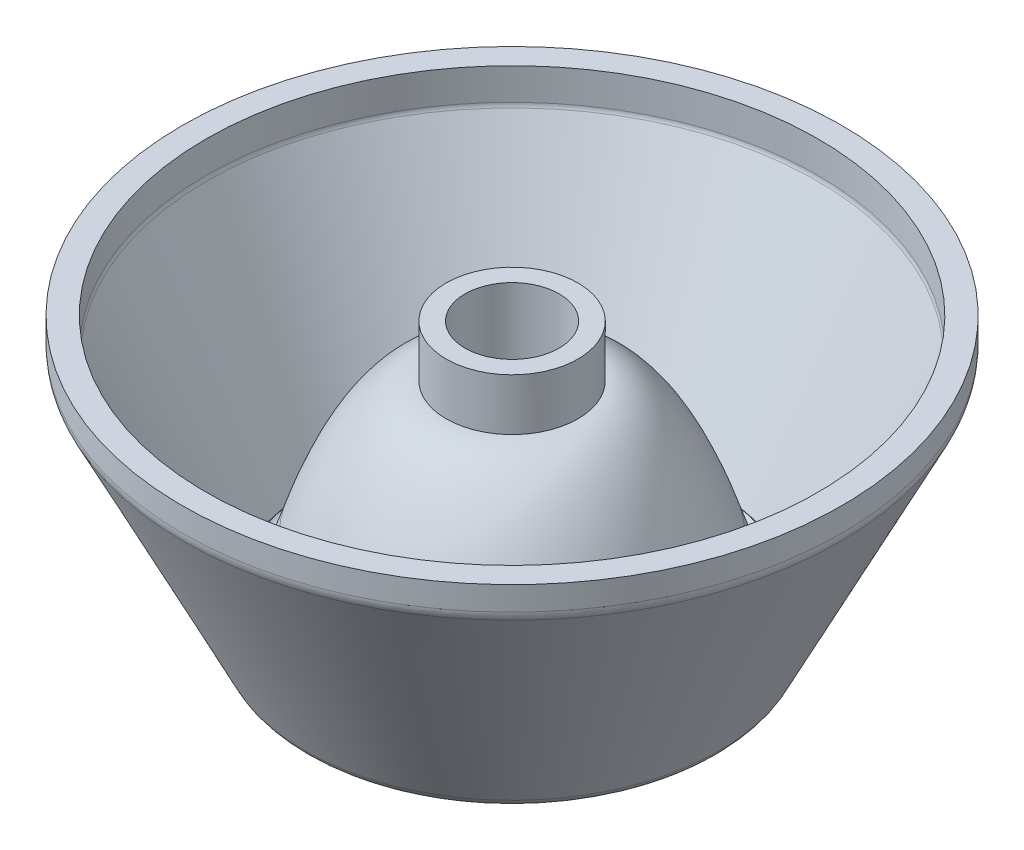
ISO-10303-21;
HEADER;
FILE_DESCRIPTION(('STEP AP214'),'2;1');
FILE_NAME('part.step','',(''),(''),'','','');
FILE_SCHEMA(('AUTOMOTIVE_DESIGN { 1 0 10303 214 1 1 1 1 }'));
ENDSEC;
DATA;
#1=APPLICATION_CONTEXT('core data for automotive mechanical design processes');
#2=APPLICATION_PROTOCOL_DEFINITION('international standard','automotive_design',2000,#1);
#3=PRODUCT_CONTEXT('',#1,'mechanical');
#4=PRODUCT('Part','Part','',(#3));
#5=PRODUCT_RELATED_PRODUCT_CATEGORY('part','',(#4));
#6=PRODUCT_DEFINITION_FORMATION('','',#4);
#7=PRODUCT_DEFINITION_CONTEXT('part definition',#1,'design');
#8=PRODUCT_DEFINITION('design','',#6,#7);
#9=PRODUCT_DEFINITION_SHAPE('','',#8);
#10=(LENGTH_UNIT() NAMED_UNIT(*) SI_UNIT(.MILLI.,.METRE.));
#11=(NAMED_UNIT(*) PLANE_ANGLE_UNIT() SI_UNIT($,.RADIAN.));
#12=(NAMED_UNIT(*) SI_UNIT($,.STERADIAN.) SOLID_ANGLE_UNIT());
#13=UNCERTAINTY_MEASURE_WITH_UNIT(LENGTH_MEASURE(1.E-05),#10,'distance_accuracy_value','');
#14=(GEOMETRIC_REPRESENTATION_CONTEXT(3) GLOBAL_UNCERTAINTY_ASSIGNED_CONTEXT((#13)) GLOBAL_UNIT_ASSIGNED_CONTEXT((#10,
#11,#12)) REPRESENTATION_CONTEXT('',''));
#15=CARTESIAN_POINT('',(0.,0.,0.));
#16=DIRECTION('',(0.,0.,1.));
#17=DIRECTION('',(1.,0.,0.));
#18=AXIS2_PLACEMENT_3D('',#15,#16,#17);
#19=CARTESIAN_POINT('',(6.41575187069401E-13,25.3119668593289,5.32451627771019E-05));
#20=DIRECTION('',(0.,-1.,0.));
#21=DIRECTION('',(0.,0.,-1.));
#22=AXIS2_PLACEMENT_3D('',#19,#20,#21);
#23=TOROIDAL_SURFACE('',#22,47.2499989103526,1.5);
#24=CARTESIAN_POINT('',(6.41947567188462E-13,24.6411464809619,5.32451627771019E-05));
#25=DIRECTION('',(0.,-1.,0.));
#26=DIRECTION('',(1.,0.,0.));
#27=AXIS2_PLACEMENT_3D('',#24,#25,#26);
#28=CIRCLE('',#27,48.5916397042939);
#29=CARTESIAN_POINT('',(-48.5916397042933,24.6411464809619,5.32451627711512E-05));
#30=VERTEX_POINT('',#29);
#31=CARTESIAN_POINT('',(6.35996807585543E-13,24.6411464809619,48.5916929494567));
#32=VERTEX_POINT('',#31);
#33=EDGE_CURVE('E11',#30,#32,#28,.T.);
#34=ORIENTED_EDGE('',*,*,#33,.T.);
#35=CARTESIAN_POINT('',(6.35788731076873E-13,25.3119668593289,47.2500521555154));
#36=DIRECTION('',(-1.,0.,0.));
#37=DIRECTION('',(0.,0.,1.));
#38=AXIS2_PLACEMENT_3D('',#35,#36,#37);
#39=CIRCLE('',#38,1.5);
#40=CARTESIAN_POINT('',(6.35605034057001E-13,25.3119668593289,48.7500521555154));
#41=VERTEX_POINT('',#40);
#42=EDGE_CURVE('E57',#32,#41,#39,.T.);
#43=ORIENTED_EDGE('',*,*,#42,.T.);
#44=CARTESIAN_POINT('',(6.41575187069401E-13,25.3119668593289,5.32451627771019E-05));
#45=DIRECTION('',(0.,-1.,0.));
#46=DIRECTION('',(1.,0.,0.));
#47=AXIS2_PLACEMENT_3D('',#44,#45,#46);
#48=CIRCLE('',#47,48.7499989103526);
#49=CARTESIAN_POINT('',(-48.7499989103519,25.3119668593289,5.32451627711318E-05));
#50=VERTEX_POINT('',#49);
#51=EDGE_CURVE('E158',#50,#41,#48,.T.);
#52=ORIENTED_EDGE('',*,*,#51,.F.);
#53=CARTESIAN_POINT('',(6.41575187069401E-13,25.3119668593289,5.32451627771019E-05));
#54=DIRECTION('',(0.,-1.,0.));
#55=DIRECTION('',(1.,0.,0.));
#56=AXIS2_PLACEMENT_3D('',#53,#54,#55);
#57=CIRCLE('',#56,48.7499989103526);
#58=EDGE_CURVE('E130',#41,#50,#57,.T.);
#59=ORIENTED_EDGE('',*,*,#58,.F.);
#60=ORIENTED_EDGE('',*,*,#42,.F.);
#61=CARTESIAN_POINT('',(6.41947567188462E-13,24.6411464809619,5.32451627771019E-05));
#62=DIRECTION('',(0.,-1.,0.));
#63=DIRECTION('',(1.,0.,0.));
#64=AXIS2_PLACEMENT_3D('',#61,#62,#63);
#65=CIRCLE('',#64,48.5916397042939);
#66=EDGE_CURVE('E234',#32,#30,#65,.T.);
#67=ORIENTED_EDGE('',*,*,#66,.T.);
#68=EDGE_LOOP('',(#34,#43,#52,#59,#60,#67));
#69=FACE_BOUND('',#68,.T.);
#70=ADVANCED_FACE('F46',(#69),#23,.F.);
#71=CARTESIAN_POINT('',(6.40174668630977E-13,27.8349165569222,5.32451627771019E-05));
#72=DIRECTION('',(0.,-1.,0.));
#73=DIRECTION('',(1.,0.,0.));
#74=AXIS2_PLACEMENT_3D('',#71,#72,#73);
#75=CYLINDRICAL_SURFACE('',#74,48.7499989103526);
#76=ORIENTED_EDGE('',*,*,#51,.T.);
#77=ORIENTED_EDGE('',*,*,#58,.T.);
#78=DIRECTION('',(0.,1.,0.));
#79=VECTOR('',#78,1.);
#80=CARTESIAN_POINT('',(-48.7499989103519,27.8349165569222,5.32451627711318E-05));
#81=LINE('',#80,#79);
#82=CARTESIAN_POINT('',(-48.7499989103519,30.3578662545155,5.32451627711318E-05));
#83=VERTEX_POINT('',#82);
#84=EDGE_CURVE('E120',#50,#83,#81,.T.);
#85=ORIENTED_EDGE('',*,*,#84,.T.);
#86=CARTESIAN_POINT('',(6.38774150192554E-13,30.3578662545155,5.32451627771019E-05));
#87=DIRECTION('',(0.,-1.,0.));
#88=DIRECTION('',(1.,0.,0.));
#89=AXIS2_PLACEMENT_3D('',#86,#87,#88);
#90=CIRCLE('',#89,48.7499989103526);
#91=EDGE_CURVE('E118',#83,#83,#90,.T.);
#92=ORIENTED_EDGE('',*,*,#91,.F.);
#93=ORIENTED_EDGE('',*,*,#84,.F.);
#94=EDGE_LOOP('',(#76,#77,#85,#92,#93));
#95=FACE_BOUND('',#94,.T.);
#96=ADVANCED_FACE('F119',(#95),#75,.F.);
#97=CARTESIAN_POINT('',(52.4999989103532,30.3578662545155,5.32451627771019E-05));
#98=DIRECTION('',(0.,1.,0.));
#99=DIRECTION('',(1.,0.,0.));
#100=AXIS2_PLACEMENT_3D('',#97,#98,#99);
#101=PLANE('',#100);
#102=CARTESIAN_POINT('',(6.38774150192554E-13,30.3578662545155,5.32451627771019E-05));
#103=DIRECTION('',(0.,-1.,0.));
#104=DIRECTION('',(1.,0.,0.));
#105=AXIS2_PLACEMENT_3D('',#102,#103,#104);
#106=CIRCLE('',#105,52.4999989103526);
#107=CARTESIAN_POINT('',(-52.499998910352,30.3578662545155,5.32451627706725E-05));
#108=VERTEX_POINT('',#107);
#109=EDGE_CURVE('E133',#108,#108,#106,.T.);
#110=ORIENTED_EDGE('',*,*,#109,.F.);
#111=EDGE_LOOP('',(#110));
#112=FACE_BOUND('',#111,.T.);
#113=ORIENTED_EDGE('',*,*,#91,.T.);
#114=EDGE_LOOP('',(#113));
#115=FACE_BOUND('',#114,.T.);
#116=ADVANCED_FACE('F470',(#112,#115),#101,.T.);
#117=CARTESIAN_POINT('',(6.39826585389041E-13,28.4619675730944,5.32451627771019E-05));
#118=DIRECTION('',(0.,-1.,0.));
#119=DIRECTION('',(1.,0.,0.));
#120=AXIS2_PLACEMENT_3D('',#117,#118,#119);
#121=CYLINDRICAL_SURFACE('',#120,52.4999989103526);
#122=CARTESIAN_POINT('',(6.40879020585528E-13,26.5660688916734,5.32451627771019E-05));
#123=DIRECTION('',(0.,-1.,0.));
#124=DIRECTION('',(1.,0.,0.));
#125=AXIS2_PLACEMENT_3D('',#122,#123,#124);
#126=CIRCLE('',#125,52.4999989103526);
#127=CARTESIAN_POINT('',(-52.499998910352,26.5660688916734,5.32451627706725E-05));
#128=VERTEX_POINT('',#127);
#129=CARTESIAN_POINT('',(6.34449625023447E-13,26.5660688916734,52.5000521555154));
#130=VERTEX_POINT('',#129);
#131=EDGE_CURVE('E159',#128,#130,#126,.T.);
#132=ORIENTED_EDGE('',*,*,#131,.F.);
#133=DIRECTION('',(0.,1.,0.));
#134=VECTOR('',#133,1.);
#135=CARTESIAN_POINT('',(-52.499998910352,28.4619675730944,5.32451627706725E-05));
#136=LINE('',#135,#134);
#137=EDGE_CURVE('E124',#128,#108,#136,.T.);
#138=ORIENTED_EDGE('',*,*,#137,.T.);
#139=ORIENTED_EDGE('',*,*,#109,.T.);
#140=ORIENTED_EDGE('',*,*,#137,.F.);
#141=CARTESIAN_POINT('',(6.40879020585528E-13,26.5660688916734,5.32451627771019E-05));
#142=DIRECTION('',(0.,-1.,0.));
#143=DIRECTION('',(1.,0.,0.));
#144=AXIS2_PLACEMENT_3D('',#141,#142,#143);
#145=CIRCLE('',#144,52.4999989103526);
#146=EDGE_CURVE('E162',#130,#128,#145,.T.);
#147=ORIENTED_EDGE('',*,*,#146,.F.);
#148=EDGE_LOOP('',(#132,#138,#139,#140,#147));
#149=FACE_BOUND('',#148,.T.);
#150=ADVANCED_FACE('F385',(#149),#121,.T.);
#151=CARTESIAN_POINT('',(6.40879020585528E-13,26.5660688916734,5.32451627771019E-05));
#152=DIRECTION('',(0.,-1.,0.));
#153=DIRECTION('',(0.,0.,-1.));
#154=AXIS2_PLACEMENT_3D('',#151,#152,#153);
#155=TOROIDAL_SURFACE('',#154,49.4999989103526,3.);
#156=CARTESIAN_POINT('',(6.41623780823649E-13,25.2244281349394,5.32451627771019E-05));
#157=DIRECTION('',(0.,-1.,0.));
#158=DIRECTION('',(1.,0.,0.));
#159=AXIS2_PLACEMENT_3D('',#156,#157,#158);
#160=CIRCLE('',#159,52.1832804982353);
#161=CARTESIAN_POINT('',(-52.1832804982347,25.2244281349394,5.32451627707113E-05));
#162=VERTEX_POINT('',#161);
#163=CARTESIAN_POINT('',(6.35233172080531E-13,25.2244281349394,52.1833337433981));
#164=VERTEX_POINT('',#163);
#165=EDGE_CURVE('E260',#162,#164,#160,.T.);
#166=ORIENTED_EDGE('',*,*,#165,.F.);
#167=CARTESIAN_POINT('',(6.41623780823649E-13,25.2244281349394,5.32451627771019E-05));
#168=DIRECTION('',(0.,-1.,0.));
#169=DIRECTION('',(1.,0.,0.));
#170=AXIS2_PLACEMENT_3D('',#167,#168,#169);
#171=CIRCLE('',#170,52.1832804982353);
#172=EDGE_CURVE('E149',#164,#162,#171,.T.);
#173=ORIENTED_EDGE('',*,*,#172,.F.);
#174=CARTESIAN_POINT('',(6.34817019063192E-13,26.5660688916734,49.5000521555154));
#175=DIRECTION('',(-1.,0.,0.));
#176=DIRECTION('',(0.,0.,1.));
#177=AXIS2_PLACEMENT_3D('',#174,#175,#176);
#178=CIRCLE('',#177,3.);
#179=EDGE_CURVE('E164',#164,#130,#178,.T.);
#180=ORIENTED_EDGE('',*,*,#179,.T.);
#181=ORIENTED_EDGE('',*,*,#146,.T.);
#182=ORIENTED_EDGE('',*,*,#131,.T.);
#183=ORIENTED_EDGE('',*,*,#179,.F.);
#184=EDGE_LOOP('',(#166,#173,#180,#181,#182,#183));
#185=FACE_BOUND('',#184,.T.);
#186=ADVANCED_FACE('F387',(#185),#155,.T.);
#187=CARTESIAN_POINT('',(6.522932673519E-13,6.00399013754829,5.32451627771019E-05));
#188=DIRECTION('',(0.,1.,0.));
#189=DIRECTION('',(1.,0.,0.));
#190=AXIS2_PLACEMENT_3D('',#187,#188,#189);
#191=CONICAL_SURFACE('',#190,42.5730617660573,0.46364759790772);
#192=CARTESIAN_POINT('',(6.62962753880151E-13,-13.2164478598429,5.32451627771019E-05));
#193=DIRECTION('',(0.,-1.,0.));
#194=DIRECTION('',(1.,0.,0.));
#195=AXIS2_PLACEMENT_3D('',#192,#193,#194);
#196=CIRCLE('',#195,32.9628430338791);
#197=CARTESIAN_POINT('',(-32.9628430338784,-13.2164478598429,5.32451627730651E-05));
#198=VERTEX_POINT('',#197);
#199=CARTESIAN_POINT('',(6.58925969858927E-13,-13.2164478598429,32.9628962790418));
#200=VERTEX_POINT('',#199);
#201=EDGE_CURVE('E143',#198,#200,#196,.T.);
#202=ORIENTED_EDGE('',*,*,#201,.F.);
#203=DIRECTION('',(-0.447213585578001,0.894427195960895,0.));
#204=VECTOR('',#203,1.);
#205=CARTESIAN_POINT('',(-42.5730617660566,6.00399013754826,5.32451627718882E-05));
#206=LINE('',#205,#204);
#207=EDGE_CURVE('E163',#198,#162,#206,.T.);
#208=ORIENTED_EDGE('',*,*,#207,.T.);
#209=ORIENTED_EDGE('',*,*,#165,.T.);
#210=ORIENTED_EDGE('',*,*,#172,.T.);
#211=ORIENTED_EDGE('',*,*,#207,.F.);
#212=CARTESIAN_POINT('',(6.62962753880151E-13,-13.2164478598429,5.32451627771019E-05));
#213=DIRECTION('',(0.,-1.,0.));
#214=DIRECTION('',(1.,0.,0.));
#215=AXIS2_PLACEMENT_3D('',#212,#213,#214);
#216=CIRCLE('',#215,32.9628430338791);
#217=EDGE_CURVE('E150',#200,#198,#216,.T.);
#218=ORIENTED_EDGE('',*,*,#217,.F.);
#219=EDGE_LOOP('',(#202,#208,#209,#210,#211,#218));
#220=FACE_BOUND('',#219,.T.);
#221=ADVANCED_FACE('F401',(#220),#191,.T.);
#222=CARTESIAN_POINT('',(6.62217993642046E-13,-11.8748071031374,5.32451627771019E-05));
#223=DIRECTION('',(0.,-1.,0.));
#224=DIRECTION('',(0.,0.,-1.));
#225=AXIS2_PLACEMENT_3D('',#222,#223,#224);
#226=TOROIDAL_SURFACE('',#225,30.2795614459821,3.);
#227=CARTESIAN_POINT('',(6.62737494728098E-13,-12.8106570512683,5.32451627771019E-05));
#228=DIRECTION('',(0.,-1.,0.));
#229=DIRECTION('',(1.,0.,0.));
#230=AXIS2_PLACEMENT_3D('',#227,#228,#229);
#231=CIRCLE('',#230,27.4292658692773);
#232=CARTESIAN_POINT('',(-27.4292658691854,-12.8106570512983,5.32451627737428E-05));
#233=VERTEX_POINT('',#232);
#234=CARTESIAN_POINT('',(6.59378378463121E-13,-12.8106570512683,27.4293191144401));
#235=VERTEX_POINT('',#234);
#236=EDGE_CURVE('E139',#233,#235,#231,.T.);
#237=ORIENTED_EDGE('',*,*,#236,.F.);
#238=CARTESIAN_POINT('',(6.62737494728098E-13,-12.8106570512683,5.32451627771019E-05));
#239=DIRECTION('',(0.,-1.,0.));
#240=DIRECTION('',(1.,0.,0.));
#241=AXIS2_PLACEMENT_3D('',#238,#239,#240);
#242=CIRCLE('',#241,27.4292658692773);
#243=EDGE_CURVE('E144',#235,#233,#242,.T.);
#244=ORIENTED_EDGE('',*,*,#243,.F.);
#245=CARTESIAN_POINT('',(6.58509816841605E-13,-11.8748071031374,30.2796146911449));
#246=DIRECTION('',(-1.,0.,0.));
#247=DIRECTION('',(0.,0.,1.));
#248=AXIS2_PLACEMENT_3D('',#245,#246,#247);
#249=CIRCLE('',#248,3.);
#250=EDGE_CURVE('E145',#235,#200,#249,.T.);
#251=ORIENTED_EDGE('',*,*,#250,.T.);
#252=ORIENTED_EDGE('',*,*,#217,.T.);
#253=ORIENTED_EDGE('',*,*,#201,.T.);
#254=ORIENTED_EDGE('',*,*,#250,.F.);
#255=EDGE_LOOP('',(#237,#244,#251,#252,#253,#254));
#256=FACE_BOUND('',#255,.T.);
#257=ADVANCED_FACE('F48',(#256),#226,.T.);
#258=CARTESIAN_POINT('',(6.59086574119904E-13,-6.23374325158445,5.32451627771019E-05));
#259=DIRECTION('',(0.,-1.,0.));
#260=DIRECTION('',(1.,0.,0.));
#261=AXIS2_PLACEMENT_3D('',#258,#259,#260);
#262=CONICAL_SURFACE('',#261,25.2698974777252,0.317236737188055);
#263=ORIENTED_EDGE('',*,*,#236,.T.);
#264=ORIENTED_EDGE('',*,*,#243,.T.);
#265=DIRECTION('',(0.311942376068758,0.950101023056274,0.));
#266=VECTOR('',#265,1.);
#267=CARTESIAN_POINT('',(-25.2698974777246,-6.23374325158446,5.32451627740072E-05));
#268=LINE('',#267,#266);
#269=CARTESIAN_POINT('',(-23.110529086264,0.343170548129381,5.32451627742717E-05));
#270=VERTEX_POINT('',#269);
#271=EDGE_CURVE('E182',#233,#270,#268,.T.);
#272=ORIENTED_EDGE('',*,*,#271,.T.);
#273=CARTESIAN_POINT('',(6.55435653511693E-13,0.343170548129396,5.32451627771019E-05));
#274=DIRECTION('',(0.,-1.,0.));
#275=DIRECTION('',(1.,0.,0.));
#276=AXIS2_PLACEMENT_3D('',#273,#274,#275);
#277=CIRCLE('',#276,23.1105290862646);
#278=CARTESIAN_POINT('',(23.1105290862653,0.343170548129411,5.32451627771019E-05));
#279=VERTEX_POINT('',#278);
#280=EDGE_CURVE('E50',#279,#270,#277,.T.);
#281=ORIENTED_EDGE('',*,*,#280,.F.);
#282=CARTESIAN_POINT('',(6.55435653511693E-13,0.343170548129396,5.32451627771019E-05));
#283=DIRECTION('',(0.,-1.,0.));
#284=DIRECTION('',(1.,0.,0.));
#285=AXIS2_PLACEMENT_3D('',#282,#283,#284);
#286=CIRCLE('',#285,23.1105290862646);
#287=EDGE_CURVE('E286',#270,#279,#286,.T.);
#288=ORIENTED_EDGE('',*,*,#287,.F.);
#289=ORIENTED_EDGE('',*,*,#271,.F.);
#290=EDGE_LOOP('',(#263,#264,#272,#281,#288,#289));
#291=FACE_BOUND('',#290,.T.);
#292=ADVANCED_FACE('F318',(#291),#262,.F.);
#293=CARTESIAN_POINT('',(10.5000001564628,18.3578673609267,5.32451627771019E-05));
#294=CARTESIAN_POINT('',(10.5000001564628,18.3578673609268,10.500053401625));
#295=CARTESIAN_POINT('',(6.45435487803671E-13,18.3578673609267,10.500053401625));
#296=CARTESIAN_POINT('',(-10.5000001564615,18.3578673609268,10.500053401625));
#297=CARTESIAN_POINT('',(-10.5000001564615,18.3578673609267,5.32451627771019E-05));
#298=CARTESIAN_POINT('',(-10.5000001564615,18.3578673609268,-10.4999469112994));
#299=CARTESIAN_POINT('',(6.45435487803671E-13,18.3578673609267,-10.4999469112994));
#300=CARTESIAN_POINT('',(10.5000001564628,18.3578673609268,-10.4999469112994));
#301=CARTESIAN_POINT('',(10.5000001564628,18.3578673609267,5.32451627771019E-05));
#302=CARTESIAN_POINT('',(17.1958450773318,18.3578673609267,5.32451627771019E-05));
#303=CARTESIAN_POINT('',(17.1958450773319,18.3578673609268,17.195898322494));
#304=CARTESIAN_POINT('',(6.45435487803671E-13,18.3578673609267,17.195898322494));
#305=CARTESIAN_POINT('',(-17.1958450773306,18.3578673609268,17.195898322494));
#306=CARTESIAN_POINT('',(-17.1958450773305,18.3578673609267,5.32451627771019E-05));
#307=CARTESIAN_POINT('',(-17.1958450773306,18.3578673609268,-17.1957918321684));
#308=CARTESIAN_POINT('',(6.45435487803671E-13,18.3578673609267,-17.1957918321684));
#309=CARTESIAN_POINT('',(17.1958450773319,18.3578673609268,-17.1957918321684));
#310=CARTESIAN_POINT('',(17.1958450773318,18.3578673609267,5.32451627771019E-05));
#311=CARTESIAN_POINT('',(23.1105290862653,0.343170548129411,5.32451627771019E-05));
#312=CARTESIAN_POINT('',(23.1105290862653,0.343170548129416,23.1105823314274));
#313=CARTESIAN_POINT('',(6.55435653511693E-13,0.343170548129396,23.1105823314274));
#314=CARTESIAN_POINT('',(-23.110529086264,0.343170548129385,23.1105823314274));
#315=CARTESIAN_POINT('',(-23.110529086264,0.343170548129381,5.32451627771019E-05));
#316=CARTESIAN_POINT('',(-23.110529086264,0.343170548129385,-23.1104758411019));
#317=CARTESIAN_POINT('',(6.55435653511693E-13,0.343170548129396,-23.1104758411019));
#318=CARTESIAN_POINT('',(23.1105290862653,0.343170548129416,-23.1104758411019));
#319=CARTESIAN_POINT('',(23.1105290862653,0.343170548129411,5.32451627771019E-05));
#320=(BOUNDED_SURFACE() B_SPLINE_SURFACE(2,2,((#293,#294,#295,#296,#297,#298,#299,#300,#301),
(#302,#303,#304,#305,#306,#307,#308,#309,#310),(#311,#312,#313,#314,#315,#316,#317,#318,#319)),
.UNSPECIFIED.,.F.,.T.,.F.) B_SPLINE_SURFACE_WITH_KNOTS((3,3),(3,2,2,2,3),(0.,0.487863217026215),
(0.,1.5707963267949,3.14159265358979,4.71238898038469,6.28318530717959),
.UNSPECIFIED.) GEOMETRIC_REPRESENTATION_ITEM() RATIONAL_B_SPLINE_SURFACE(((1.,0.707106781186548,
1.,0.707106781186548,1.,0.707106781186548,1.,0.707106781186548,1.),(0.970395916349225,
0.686173532886271,0.970395916349225,0.686173532886271,0.970395916349225,0.686173532886271,
0.970395916349225,0.686173532886271,0.970395916349225),(1.,0.707106781186548,1.,
0.707106781186548,1.,0.707106781186548,1.,0.707106781186548,1.))) REPRESENTATION_ITEM('') SURFACE());
#321=CARTESIAN_POINT('',(10.5000001564628,-136.057969775754,5.32451627771019E-05));
#322=DIRECTION('',(0.,0.,1.));
#323=DIRECTION('',(0.,1.,0.));
#324=AXIS2_PLACEMENT_3D('',#321,#322,#323);
#325=ELLIPSE('',#324,154.415837136681,26.9030665624052);
#326=CARTESIAN_POINT('',(10.5000001564628,18.3578673609267,5.32451627771019E-05));
#327=VERTEX_POINT('',#326);
#328=EDGE_CURVE('E283',#279,#327,#325,.T.);
#329=CARTESIAN_POINT('',(6.45435487803671E-13,18.3578673609267,5.32451627771019E-05));
#330=DIRECTION('',(0.,-1.,0.));
#331=DIRECTION('',(1.,0.,0.));
#332=AXIS2_PLACEMENT_3D('',#329,#330,#331);
#333=CIRCLE('',#332,10.5000001564622);
#334=EDGE_CURVE('E287',#327,#327,#333,.T.);
#335=ORIENTED_EDGE('',*,*,#328,.F.);
#336=ORIENTED_EDGE('',*,*,#280,.T.);
#337=ORIENTED_EDGE('',*,*,#287,.T.);
#338=ORIENTED_EDGE('',*,*,#328,.T.);
#339=ORIENTED_EDGE('',*,*,#334,.F.);
#340=EDGE_LOOP('',(#335,#336,#337,#338,#339));
#341=FACE_BOUND('',#340,.T.);
#342=ADVANCED_FACE('F311',(#341),#320,.T.);
#343=CARTESIAN_POINT('',(7.50000039115617,18.3578673609267,5.32451627771019E-05));
#344=DIRECTION('',(0.,-1.,0.));
#345=DIRECTION('',(0.,0.,-1.));
#346=AXIS2_PLACEMENT_3D('',#343,#344,#345);
#347=PLANE('',#346);
#348=ORIENTED_EDGE('',*,*,#334,.T.);
#349=EDGE_LOOP('',(#348));
#350=FACE_BOUND('',#349,.T.);
#351=CARTESIAN_POINT('',(6.45435487803671E-13,18.3578673609267,5.32451627771019E-05));
#352=DIRECTION('',(0.,-1.,0.));
#353=DIRECTION('',(1.,0.,0.));
#354=AXIS2_PLACEMENT_3D('',#351,#352,#353);
#355=CIRCLE('',#354,7.50000039115552);
#356=CARTESIAN_POINT('',(-7.5000003911548,18.3578673609267,5.32451627761834E-05));
#357=VERTEX_POINT('',#356);
#358=EDGE_CURVE('E254',#357,#357,#355,.T.);
#359=ORIENTED_EDGE('',*,*,#358,.F.);
#360=EDGE_LOOP('',(#359));
#361=FACE_BOUND('',#360,.T.);
#362=ADVANCED_FACE('F423',(#350,#361),#347,.T.);
#363=CARTESIAN_POINT('',(6.42312985813E-13,23.982866816103,5.32451627771019E-05));
#364=DIRECTION('',(0.,-1.,0.));
#365=DIRECTION('',(1.,0.,0.));
#366=AXIS2_PLACEMENT_3D('',#363,#364,#365);
#367=CYLINDRICAL_SURFACE('',#366,7.50000039115545);
#368=ORIENTED_EDGE('',*,*,#358,.T.);
#369=DIRECTION('',(0.,1.,0.));
#370=VECTOR('',#369,1.);
#371=CARTESIAN_POINT('',(-7.5000003911548,23.982866816103,5.32451627761834E-05));
#372=LINE('',#371,#370);
#373=CARTESIAN_POINT('',(-7.5000003911548,29.6078662712793,5.32451627761834E-05));
#374=VERTEX_POINT('',#373);
#375=EDGE_CURVE('E250',#357,#374,#372,.T.);
#376=ORIENTED_EDGE('',*,*,#375,.T.);
#377=CARTESIAN_POINT('',(6.39190483822329E-13,29.6078662712793,5.32451627771019E-05));
#378=DIRECTION('',(0.,-1.,0.));
#379=DIRECTION('',(1.,0.,0.));
#380=AXIS2_PLACEMENT_3D('',#377,#378,#379);
#381=CIRCLE('',#380,7.50000039115572);
#382=EDGE_CURVE('E172',#374,#374,#381,.T.);
#383=ORIENTED_EDGE('',*,*,#382,.F.);
#384=ORIENTED_EDGE('',*,*,#375,.F.);
#385=EDGE_LOOP('',(#368,#376,#383,#384));
#386=FACE_BOUND('',#385,.T.);
#387=ADVANCED_FACE('F484',(#386),#367,.F.);
#388=CARTESIAN_POINT('',(10.5000001564628,29.6078662712793,5.32451627771019E-05));
#389=DIRECTION('',(0.,1.,0.));
#390=DIRECTION('',(1.,0.,0.));
#391=AXIS2_PLACEMENT_3D('',#388,#389,#390);
#392=PLANE('',#391);
#393=CARTESIAN_POINT('',(6.39190483822329E-13,29.6078662712793,5.32451627771019E-05));
#394=DIRECTION('',(0.,-1.,0.));
#395=DIRECTION('',(1.,0.,0.));
#396=AXIS2_PLACEMENT_3D('',#393,#394,#395);
#397=CIRCLE('',#396,10.5000001564622);
#398=CARTESIAN_POINT('',(-10.5000001564616,29.6078662712793,5.3245162775816E-05));
#399=VERTEX_POINT('',#398);
#400=EDGE_CURVE('E173',#399,#399,#397,.T.);
#401=ORIENTED_EDGE('',*,*,#400,.F.);
#402=EDGE_LOOP('',(#401));
#403=FACE_BOUND('',#402,.T.);
#404=ORIENTED_EDGE('',*,*,#382,.T.);
#405=EDGE_LOOP('',(#404));
#406=FACE_BOUND('',#405,.T.);
#407=ADVANCED_FACE('F505',(#403,#406),#392,.T.);
#408=CARTESIAN_POINT('',(6.41480318534838E-13,25.482866816103,5.32451627771019E-05));
#409=DIRECTION('',(0.,-1.,0.));
#410=DIRECTION('',(1.,0.,0.));
#411=AXIS2_PLACEMENT_3D('',#408,#409,#410);
#412=CYLINDRICAL_SURFACE('',#411,10.5000001564622);
#413=CARTESIAN_POINT('',(6.43770153247346E-13,21.3578673609267,5.32451627771019E-05));
#414=DIRECTION('',(0.,-1.,0.));
#415=DIRECTION('',(1.,0.,0.));
#416=AXIS2_PLACEMENT_3D('',#413,#414,#415);
#417=CIRCLE('',#416,10.5000001564661);
#418=CARTESIAN_POINT('',(10.5000001564667,21.3578673609267,5.32451627771019E-05));
#419=VERTEX_POINT('',#418);
#420=CARTESIAN_POINT('',(-10.5000001564615,21.3578673609267,5.3245162775816E-05));
#421=VERTEX_POINT('',#420);
#422=EDGE_CURVE('E198',#419,#421,#417,.T.);
#423=ORIENTED_EDGE('',*,*,#422,.F.);
#424=CARTESIAN_POINT('',(6.43770153247346E-13,21.3578673609267,5.32451627771019E-05));
#425=DIRECTION('',(0.,-1.,0.));
#426=DIRECTION('',(1.,0.,0.));
#427=AXIS2_PLACEMENT_3D('',#424,#425,#426);
#428=CIRCLE('',#427,10.5000001564661);
#429=EDGE_CURVE('E186',#421,#419,#428,.T.);
#430=ORIENTED_EDGE('',*,*,#429,.F.);
#431=DIRECTION('',(0.,1.,0.));
#432=VECTOR('',#431,1.);
#433=CARTESIAN_POINT('',(-10.5000001564616,25.482866816103,5.3245162775816E-05));
#434=LINE('',#433,#432);
#435=EDGE_CURVE('E168',#421,#399,#434,.T.);
#436=ORIENTED_EDGE('',*,*,#435,.T.);
#437=ORIENTED_EDGE('',*,*,#400,.T.);
#438=ORIENTED_EDGE('',*,*,#435,.F.);
#439=EDGE_LOOP('',(#423,#430,#436,#437,#438));
#440=FACE_BOUND('',#439,.T.);
#441=ADVANCED_FACE('F544',(#440),#412,.T.);
#442=CARTESIAN_POINT('',(26.1941431250778,0.406022270334131,5.32451627771019E-05));
#443=CARTESIAN_POINT('',(26.1941431250778,0.406022270334132,26.19419637024));
#444=CARTESIAN_POINT('',(6.55400763796722E-13,0.406022270334116,26.19419637024));
#445=CARTESIAN_POINT('',(-26.1941431250766,0.4060222703341,26.19419637024));
#446=CARTESIAN_POINT('',(-26.1941431250766,0.406022270334101,5.32451627771019E-05));
#447=CARTESIAN_POINT('',(-26.1941431250766,0.4060222703341,-26.1940898799144));
#448=CARTESIAN_POINT('',(6.55400763796722E-13,0.406022270334116,-26.1940898799144));
#449=CARTESIAN_POINT('',(26.1941431250778,0.406022270334132,-26.1940898799144));
#450=CARTESIAN_POINT('',(26.1941431250778,0.406022270334131,5.32451627771019E-05));
#451=CARTESIAN_POINT('',(19.2897684219077,21.3578673609287,5.32451627771019E-05));
#452=CARTESIAN_POINT('',(19.2897684219077,21.3578673609287,19.2898216670698));
#453=CARTESIAN_POINT('',(6.43770153247345E-13,21.3578673609287,19.2898216670698));
#454=CARTESIAN_POINT('',(-19.2897684219064,21.3578673609287,19.2898216670698));
#455=CARTESIAN_POINT('',(-19.2897684219064,21.3578673609287,5.32451627771019E-05));
#456=CARTESIAN_POINT('',(-19.2897684219064,21.3578673609287,-19.2897151767443));
#457=CARTESIAN_POINT('',(6.43770153247345E-13,21.3578673609287,-19.2897151767443));
#458=CARTESIAN_POINT('',(19.2897684219077,21.3578673609287,-19.2897151767443));
#459=CARTESIAN_POINT('',(19.2897684219077,21.3578673609287,5.32451627771019E-05));
#460=CARTESIAN_POINT('',(10.5000001564667,21.3578673609267,5.32451627771019E-05));
#461=CARTESIAN_POINT('',(10.5000001564667,21.3578673609268,10.5000534016288));
#462=CARTESIAN_POINT('',(6.43770153247346E-13,21.3578673609267,10.5000534016289));
#463=CARTESIAN_POINT('',(-10.5000001564654,21.3578673609268,10.5000534016288));
#464=CARTESIAN_POINT('',(-10.5000001564654,21.3578673609267,5.32451627771019E-05));
#465=CARTESIAN_POINT('',(-10.5000001564654,21.3578673609268,-10.4999469113033));
#466=CARTESIAN_POINT('',(6.43770153247346E-13,21.3578673609267,-10.4999469113033));
#467=CARTESIAN_POINT('',(10.5000001564667,21.3578673609268,-10.4999469113033));
#468=CARTESIAN_POINT('',(10.5000001564667,21.3578673609267,5.32451627771019E-05));
#469=(BOUNDED_SURFACE() B_SPLINE_SURFACE(2,2,((#442,#443,#444,#445,#446,#447,#448,#449,#450),
(#451,#452,#453,#454,#455,#456,#457,#458,#459),(#460,#461,#462,#463,#464,#465,#466,#467,#468)),
.UNSPECIFIED.,.F.,.T.,.F.) B_SPLINE_SURFACE_WITH_KNOTS((3,3),(3,2,2,2,3),(-0.667290521982324,
0.),(0.,1.5707963267949,3.14159265358979,4.71238898038469,6.28318530717959),
.UNSPECIFIED.) GEOMETRIC_REPRESENTATION_ITEM() RATIONAL_B_SPLINE_SURFACE(((1.,0.707106781186548,
1.,0.707106781186548,1.,0.707106781186548,1.,0.707106781186548,1.),(0.944854839269347,
0.668113264084281,0.944854839269347,0.668113264084281,0.944854839269347,0.668113264084281,
0.944854839269347,0.668113264084281,0.944854839269347),(1.,0.707106781186548,1.,
0.707106781186548,1.,0.707106781186548,1.,0.707106781186548,1.))) REPRESENTATION_ITEM('') SURFACE());
#470=CARTESIAN_POINT('',(10.5000001564891,-76.320339865722,5.32451627771019E-05));
#471=DIRECTION('',(0.,0.,-1.));
#472=DIRECTION('',(-2.28937523180703E-13,1.,0.));
#473=AXIS2_PLACEMENT_3D('',#470,#471,#472);
#474=ELLIPSE('',#473,97.6782072266487,25.359764592639);
#475=CARTESIAN_POINT('',(26.1941431263414,0.406022270500527,5.32451627771019E-05));
#476=VERTEX_POINT('',#475);
#477=EDGE_CURVE('E183',#419,#476,#474,.T.);
#478=CARTESIAN_POINT('',(6.5540076379663E-13,0.406022270500512,5.32451627771019E-05));
#479=DIRECTION('',(0.,-1.,0.));
#480=DIRECTION('',(1.,0.,0.));
#481=AXIS2_PLACEMENT_3D('',#478,#479,#480);
#482=CIRCLE('',#481,26.1941431263408);
#483=CARTESIAN_POINT('',(-26.1941431263402,0.406022270500497,5.32451627738941E-05));
#484=VERTEX_POINT('',#483);
#485=EDGE_CURVE('E201',#484,#476,#482,.T.);
#486=CARTESIAN_POINT('',(6.5540076379663E-13,0.406022270500512,5.32451627771019E-05));
#487=DIRECTION('',(0.,-1.,0.));
#488=DIRECTION('',(1.,0.,0.));
#489=AXIS2_PLACEMENT_3D('',#486,#487,#488);
#490=CIRCLE('',#489,26.1941431263408);
#491=EDGE_CURVE('E211',#476,#484,#490,.T.);
#492=ORIENTED_EDGE('',*,*,#477,.F.);
#493=ORIENTED_EDGE('',*,*,#422,.T.);
#494=ORIENTED_EDGE('',*,*,#429,.T.);
#495=ORIENTED_EDGE('',*,*,#477,.T.);
#496=ORIENTED_EDGE('',*,*,#485,.F.);
#497=ORIENTED_EDGE('',*,*,#491,.F.);
#498=EDGE_LOOP('',(#492,#493,#494,#495,#496,#497));
#499=FACE_BOUND('',#498,.T.);
#500=ADVANCED_FACE('F433',(#499),#469,.T.);
#501=CARTESIAN_POINT('',(6.5802177128354E-13,-4.31556501108664,5.32451627771019E-05));
#502=DIRECTION('',(0.,-1.,0.));
#503=DIRECTION('',(1.,0.,0.));
#504=AXIS2_PLACEMENT_3D('',#501,#502,#503);
#505=CONICAL_SURFACE('',#504,27.7500989665392,0.31833343610865);
#506=CARTESIAN_POINT('',(6.6064277877045E-13,-9.03715229267378,5.32451627771019E-05));
#507=DIRECTION('',(0.,-1.,0.));
#508=DIRECTION('',(1.,0.,0.));
#509=AXIS2_PLACEMENT_3D('',#506,#507,#508);
#510=CIRCLE('',#509,29.3060548067378);
#511=CARTESIAN_POINT('',(-29.3060548067371,-9.0371522926738,5.3245162773513E-05));
#512=VERTEX_POINT('',#511);
#513=CARTESIAN_POINT('',(6.5705382214898E-13,-9.03715229267378,29.3061080519005));
#514=VERTEX_POINT('',#513);
#515=EDGE_CURVE('E243',#512,#514,#510,.T.);
#516=ORIENTED_EDGE('',*,*,#515,.F.);
#517=DIRECTION('',(0.312984163032231,0.949758344891485,0.));
#518=VECTOR('',#517,1.);
#519=CARTESIAN_POINT('',(-27.7500989665386,-4.31556501108666,5.32451627737035E-05));
#520=LINE('',#519,#518);
#521=EDGE_CURVE('E187',#512,#484,#520,.T.);
#522=ORIENTED_EDGE('',*,*,#521,.T.);
#523=ORIENTED_EDGE('',*,*,#485,.T.);
#524=ORIENTED_EDGE('',*,*,#491,.T.);
#525=ORIENTED_EDGE('',*,*,#521,.F.);
#526=CARTESIAN_POINT('',(6.6064277877045E-13,-9.03715229267378,5.32451627771019E-05));
#527=DIRECTION('',(0.,-1.,0.));
#528=DIRECTION('',(1.,0.,0.));
#529=AXIS2_PLACEMENT_3D('',#526,#527,#528);
#530=CIRCLE('',#529,29.3060548067378);
#531=EDGE_CURVE('E223',#514,#512,#530,.T.);
#532=ORIENTED_EDGE('',*,*,#531,.F.);
#533=EDGE_LOOP('',(#516,#522,#523,#524,#525,#532));
#534=FACE_BOUND('',#533,.T.);
#535=ADVANCED_FACE('F413',(#534),#505,.T.);
#536=CARTESIAN_POINT('',(6.62217993642046E-13,-11.8748071031374,5.32451627771019E-05));
#537=DIRECTION('',(0.,-1.,0.));
#538=DIRECTION('',(0.,0.,-1.));
#539=AXIS2_PLACEMENT_3D('',#536,#537,#538);
#540=TOROIDAL_SURFACE('',#539,30.2795614459821,3.);
#541=CARTESIAN_POINT('',(6.6062591433161E-13,-9.00677202083664,5.32451627771019E-05));
#542=DIRECTION('',(0.,-1.,0.));
#543=DIRECTION('',(1.,0.,0.));
#544=AXIS2_PLACEMENT_3D('',#541,#542,#543);
#545=CIRCLE('',#544,29.3995757832056);
#546=CARTESIAN_POINT('',(6.57025504693691E-13,-9.00677202083664,29.3996290283683));
#547=VERTEX_POINT('',#546);
#548=EDGE_CURVE('E137',#547,#547,#545,.T.);
#549=ORIENTED_EDGE('',*,*,#548,.F.);
#550=CARTESIAN_POINT('',(6.58509816841605E-13,-11.8748071031374,30.2796146911449));
#551=DIRECTION('',(-1.,0.,0.));
#552=DIRECTION('',(0.,0.,1.));
#553=AXIS2_PLACEMENT_3D('',#550,#551,#552);
#554=CIRCLE('',#553,3.);
#555=EDGE_CURVE('E219',#547,#514,#554,.T.);
#556=ORIENTED_EDGE('',*,*,#555,.T.);
#557=ORIENTED_EDGE('',*,*,#531,.T.);
#558=ORIENTED_EDGE('',*,*,#515,.T.);
#559=ORIENTED_EDGE('',*,*,#555,.F.);
#560=EDGE_LOOP('',(#549,#556,#557,#558,#559));
#561=FACE_BOUND('',#560,.T.);
#562=ADVANCED_FACE('F408',(#561),#540,.T.);
#563=CARTESIAN_POINT('',(6.60100767584637E-13,-8.06075175425598,5.32451627771019E-05));
#564=DIRECTION('',(0.,-1.,0.));
#565=DIRECTION('',(0.,0.,-1.));
#566=AXIS2_PLACEMENT_3D('',#563,#564,#565);
#567=TOROIDAL_SURFACE('',#566,30.5636400663183,1.5);
#568=ORIENTED_EDGE('',*,*,#548,.T.);
#569=CARTESIAN_POINT('',(6.56357801186886E-13,-8.06075175425598,30.5636933114811));
#570=DIRECTION('',(-1.,0.,0.));
#571=DIRECTION('',(0.,0.,1.));
#572=AXIS2_PLACEMENT_3D('',#569,#570,#571);
#573=CIRCLE('',#572,1.5);
#574=CARTESIAN_POINT('',(6.56849059954326E-13,-9.16878079328558,31.5747678135169));
#575=VERTEX_POINT('',#574);
#576=EDGE_CURVE('E151',#547,#575,#573,.T.);
#577=ORIENTED_EDGE('',*,*,#576,.T.);
#578=CARTESIAN_POINT('',(6.60715847267339E-13,-9.16878079328558,5.32451627771019E-05));
#579=DIRECTION('',(0.,-1.,0.));
#580=DIRECTION('',(1.,0.,0.));
#581=AXIS2_PLACEMENT_3D('',#578,#579,#580);
#582=CIRCLE('',#581,31.5747145683541);
#583=EDGE_CURVE('E178',#575,#575,#582,.T.);
#584=ORIENTED_EDGE('',*,*,#583,.F.);
#585=ORIENTED_EDGE('',*,*,#576,.F.);
#586=EDGE_LOOP('',(#568,#577,#584,#585));
#587=FACE_BOUND('',#586,.T.);
#588=ADVANCED_FACE('F412',(#587),#567,.F.);
#589=CARTESIAN_POINT('',(6.62217993642046E-13,-11.8748071031374,5.32451627771019E-05));
#590=DIRECTION('',(0.,-1.,0.));
#591=DIRECTION('',(0.,0.,-1.));
#592=AXIS2_PLACEMENT_3D('',#589,#590,#591);
#593=TOROIDAL_SURFACE('',#592,30.2795614459821,3.);
#594=CARTESIAN_POINT('',(6.60740679959797E-13,-9.21351539456441,5.32451627771019E-05));
#595=DIRECTION('',(0.,-1.,0.));
#596=DIRECTION('',(1.,0.,0.));
#597=AXIS2_PLACEMENT_3D('',#594,#595,#596);
#598=CIRCLE('',#597,31.6643092359717);
#599=CARTESIAN_POINT('',(-31.6643092359711,-9.21351539456444,5.32451627732242E-05));
#600=VERTEX_POINT('',#599);
#601=CARTESIAN_POINT('',(6.56862920464492E-13,-9.21351539456441,31.6643624811345));
#602=VERTEX_POINT('',#601);
#603=EDGE_CURVE('E174',#600,#602,#598,.T.);
#604=ORIENTED_EDGE('',*,*,#603,.F.);
#605=CARTESIAN_POINT('',(6.60740679959797E-13,-9.21351539456441,5.32451627771019E-05));
#606=DIRECTION('',(0.,-1.,0.));
#607=DIRECTION('',(1.,0.,0.));
#608=AXIS2_PLACEMENT_3D('',#605,#606,#607);
#609=CIRCLE('',#608,31.6643092359717);
#610=EDGE_CURVE('E179',#602,#600,#609,.T.);
#611=ORIENTED_EDGE('',*,*,#610,.F.);
#612=CARTESIAN_POINT('',(6.58509816841605E-13,-11.8748071031374,30.2796146911449));
#613=DIRECTION('',(-1.,0.,0.));
#614=DIRECTION('',(0.,0.,1.));
#615=AXIS2_PLACEMENT_3D('',#612,#613,#614);
#616=CIRCLE('',#615,3.);
#617=EDGE_CURVE('E155',#602,#575,#616,.T.);
#618=ORIENTED_EDGE('',*,*,#617,.T.);
#619=ORIENTED_EDGE('',*,*,#583,.T.);
#620=ORIENTED_EDGE('',*,*,#617,.F.);
#621=EDGE_LOOP('',(#604,#611,#618,#619,#620));
#622=FACE_BOUND('',#621,.T.);
#623=ADVANCED_FACE('F462',(#622),#593,.T.);
#624=CARTESIAN_POINT('',(6.51344123574129E-13,7.71381554319874,5.32451627771019E-05));
#625=DIRECTION('',(0.,1.,0.));
#626=DIRECTION('',(1.,0.,0.));
#627=AXIS2_PLACEMENT_3D('',#624,#625,#626);
#628=CONICAL_SURFACE('',#627,40.1279744701329,0.463647597907719);
#629=ORIENTED_EDGE('',*,*,#603,.T.);
#630=ORIENTED_EDGE('',*,*,#610,.T.);
#631=DIRECTION('',(-0.447213585578,0.894427195960895,0.));
#632=VECTOR('',#631,1.);
#633=CARTESIAN_POINT('',(-40.1279744701323,7.71381554319873,5.32451627721877E-05));
#634=LINE('',#633,#632);
#635=EDGE_CURVE('E227',#600,#30,#634,.T.);
#636=ORIENTED_EDGE('',*,*,#635,.T.);
#637=ORIENTED_EDGE('',*,*,#66,.F.);
#638=ORIENTED_EDGE('',*,*,#33,.F.);
#639=ORIENTED_EDGE('',*,*,#635,.F.);
#640=EDGE_LOOP('',(#629,#630,#636,#637,#638,#639));
#641=FACE_BOUND('',#640,.T.);
#642=ADVANCED_FACE('F532',(#641),#628,.F.);
#643=CLOSED_SHELL('',(#70,#96,#116,#150,#186,#221,#257,#292,#342,#362,#387,#407,#441,#500,#535,
#562,#588,#623,#642));
#644=MANIFOLD_SOLID_BREP('B2',#643);
#645=ADVANCED_BREP_SHAPE_REPRESENTATION('',(#18,#644),#14);
#646=SHAPE_DEFINITION_REPRESENTATION(#9,#645);
ENDSEC;
END-ISO-10303-21;
